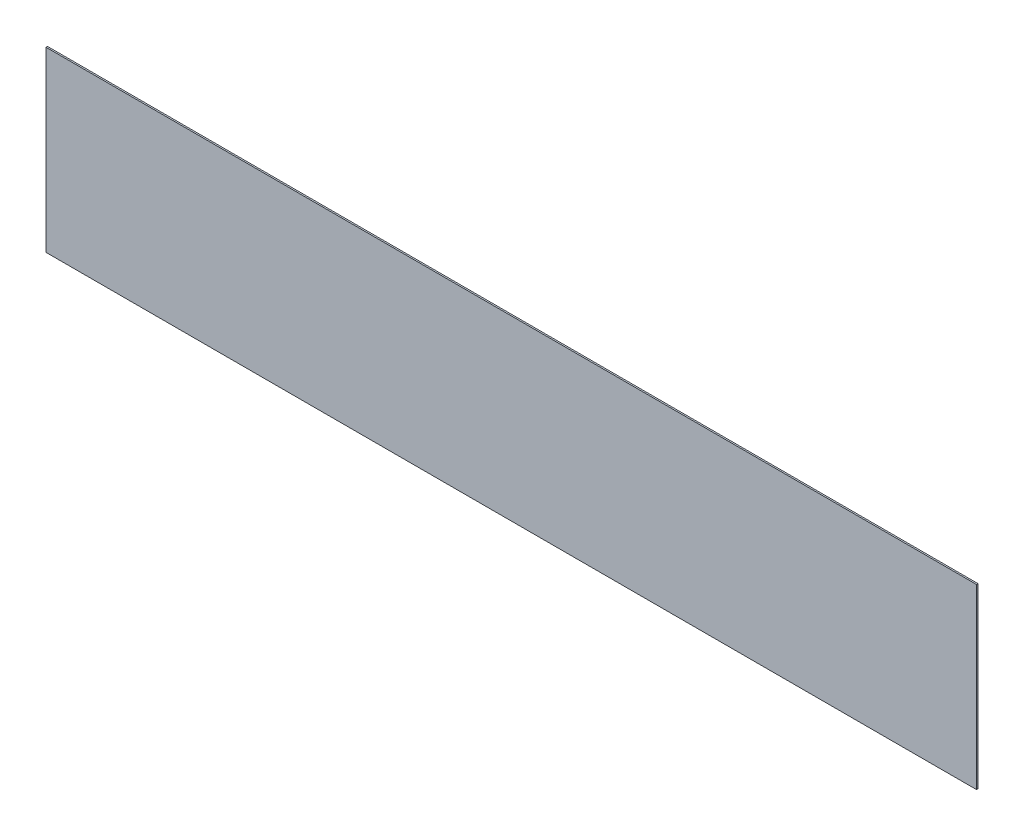
ISO-10303-21;
HEADER;
FILE_DESCRIPTION(('STEP AP214'),'2;1');
FILE_NAME('part.step','',(''),(''),'','','');
FILE_SCHEMA(('AUTOMOTIVE_DESIGN { 1 0 10303 214 1 1 1 1 }'));
ENDSEC;
DATA;
#1=APPLICATION_CONTEXT('core data for automotive mechanical design processes');
#2=APPLICATION_PROTOCOL_DEFINITION('international standard','automotive_design',2000,#1);
#3=PRODUCT_CONTEXT('',#1,'mechanical');
#4=PRODUCT('Part','Part','',(#3));
#5=PRODUCT_RELATED_PRODUCT_CATEGORY('part','',(#4));
#6=PRODUCT_DEFINITION_FORMATION('','',#4);
#7=PRODUCT_DEFINITION_CONTEXT('part definition',#1,'design');
#8=PRODUCT_DEFINITION('design','',#6,#7);
#9=PRODUCT_DEFINITION_SHAPE('','',#8);
#10=(LENGTH_UNIT() NAMED_UNIT(*) SI_UNIT(.MILLI.,.METRE.));
#11=(NAMED_UNIT(*) PLANE_ANGLE_UNIT() SI_UNIT($,.RADIAN.));
#12=(NAMED_UNIT(*) SI_UNIT($,.STERADIAN.) SOLID_ANGLE_UNIT());
#13=UNCERTAINTY_MEASURE_WITH_UNIT(LENGTH_MEASURE(1.E-05),#10,'distance_accuracy_value','');
#14=(GEOMETRIC_REPRESENTATION_CONTEXT(3) GLOBAL_UNCERTAINTY_ASSIGNED_CONTEXT((#13)) GLOBAL_UNIT_ASSIGNED_CONTEXT((#10,
#11,#12)) REPRESENTATION_CONTEXT('',''));
#15=CARTESIAN_POINT('',(0.,0.,0.));
#16=DIRECTION('',(0.,0.,1.));
#17=DIRECTION('',(1.,0.,0.));
#18=AXIS2_PLACEMENT_3D('',#15,#16,#17);
#19=CARTESIAN_POINT('',(0.,0.,1.));
#20=DIRECTION('',(1.,0.,0.));
#21=DIRECTION('',(0.,0.,-1.));
#22=AXIS2_PLACEMENT_3D('',#19,#20,#21);
#23=PLANE('',#22);
#24=DIRECTION('',(0.,-1.,0.));
#25=VECTOR('',#24,1.);
#26=CARTESIAN_POINT('',(0.,0.,0.));
#27=LINE('',#26,#25);
#28=CARTESIAN_POINT('',(0.,118.,0.));
#29=VERTEX_POINT('',#28);
#30=CARTESIAN_POINT('',(0.,0.,0.));
#31=VERTEX_POINT('',#30);
#32=EDGE_CURVE('E102',#29,#31,#27,.T.);
#33=ORIENTED_EDGE('',*,*,#32,.T.);
#34=DIRECTION('',(0.,0.,-1.));
#35=VECTOR('',#34,1.);
#36=CARTESIAN_POINT('',(0.,0.,1.));
#37=LINE('',#36,#35);
#38=CARTESIAN_POINT('',(0.,0.,1.));
#39=VERTEX_POINT('',#38);
#40=EDGE_CURVE('E11',#39,#31,#37,.T.);
#41=ORIENTED_EDGE('',*,*,#40,.F.);
#42=DIRECTION('',(0.,-1.,0.));
#43=VECTOR('',#42,1.);
#44=CARTESIAN_POINT('',(0.,0.,1.));
#45=LINE('',#44,#43);
#46=CARTESIAN_POINT('',(0.,118.,1.));
#47=VERTEX_POINT('',#46);
#48=EDGE_CURVE('E90',#47,#39,#45,.T.);
#49=ORIENTED_EDGE('',*,*,#48,.F.);
#50=DIRECTION('',(0.,0.,-1.));
#51=VECTOR('',#50,1.);
#52=CARTESIAN_POINT('',(0.,118.,1.));
#53=LINE('',#52,#51);
#54=EDGE_CURVE('E98',#47,#29,#53,.T.);
#55=ORIENTED_EDGE('',*,*,#54,.T.);
#56=EDGE_LOOP('',(#33,#41,#49,#55));
#57=FACE_BOUND('',#56,.T.);
#58=ADVANCED_FACE('F39',(#57),#23,.F.);
#59=CARTESIAN_POINT('',(0.,0.,1.));
#60=DIRECTION('',(0.,1.,0.));
#61=DIRECTION('',(0.,0.,1.));
#62=AXIS2_PLACEMENT_3D('',#59,#60,#61);
#63=PLANE('',#62);
#64=DIRECTION('',(1.,0.,0.));
#65=VECTOR('',#64,1.);
#66=CARTESIAN_POINT('',(0.,0.,0.));
#67=LINE('',#66,#65);
#68=CARTESIAN_POINT('',(618.,0.,0.));
#69=VERTEX_POINT('',#68);
#70=EDGE_CURVE('E94',#31,#69,#67,.T.);
#71=ORIENTED_EDGE('',*,*,#70,.T.);
#72=DIRECTION('',(0.,0.,-1.));
#73=VECTOR('',#72,1.);
#74=CARTESIAN_POINT('',(618.,0.,1.));
#75=LINE('',#74,#73);
#76=CARTESIAN_POINT('',(618.,0.,1.));
#77=VERTEX_POINT('',#76);
#78=EDGE_CURVE('E47',#77,#69,#75,.T.);
#79=ORIENTED_EDGE('',*,*,#78,.F.);
#80=DIRECTION('',(1.,0.,0.));
#81=VECTOR('',#80,1.);
#82=CARTESIAN_POINT('',(0.,0.,1.));
#83=LINE('',#82,#81);
#84=EDGE_CURVE('E85',#39,#77,#83,.T.);
#85=ORIENTED_EDGE('',*,*,#84,.F.);
#86=ORIENTED_EDGE('',*,*,#40,.T.);
#87=EDGE_LOOP('',(#71,#79,#85,#86));
#88=FACE_BOUND('',#87,.T.);
#89=ADVANCED_FACE('F93',(#88),#63,.F.);
#90=CARTESIAN_POINT('',(618.,0.,1.));
#91=DIRECTION('',(-1.,0.,0.));
#92=DIRECTION('',(0.,0.,1.));
#93=AXIS2_PLACEMENT_3D('',#90,#91,#92);
#94=PLANE('',#93);
#95=DIRECTION('',(0.,1.,0.));
#96=VECTOR('',#95,1.);
#97=CARTESIAN_POINT('',(618.,0.,0.));
#98=LINE('',#97,#96);
#99=CARTESIAN_POINT('',(618.,118.,0.));
#100=VERTEX_POINT('',#99);
#101=EDGE_CURVE('E72',#69,#100,#98,.T.);
#102=ORIENTED_EDGE('',*,*,#101,.T.);
#103=DIRECTION('',(0.,0.,-1.));
#104=VECTOR('',#103,1.);
#105=CARTESIAN_POINT('',(618.,118.,1.));
#106=LINE('',#105,#104);
#107=CARTESIAN_POINT('',(618.,118.,1.));
#108=VERTEX_POINT('',#107);
#109=EDGE_CURVE('E95',#108,#100,#106,.T.);
#110=ORIENTED_EDGE('',*,*,#109,.F.);
#111=DIRECTION('',(0.,1.,0.));
#112=VECTOR('',#111,1.);
#113=CARTESIAN_POINT('',(618.,0.,1.));
#114=LINE('',#113,#112);
#115=EDGE_CURVE('E88',#77,#108,#114,.T.);
#116=ORIENTED_EDGE('',*,*,#115,.F.);
#117=ORIENTED_EDGE('',*,*,#78,.T.);
#118=EDGE_LOOP('',(#102,#110,#116,#117));
#119=FACE_BOUND('',#118,.T.);
#120=ADVANCED_FACE('F96',(#119),#94,.F.);
#121=CARTESIAN_POINT('',(0.,118.,1.));
#122=DIRECTION('',(0.,-1.,0.));
#123=DIRECTION('',(0.,0.,-1.));
#124=AXIS2_PLACEMENT_3D('',#121,#122,#123);
#125=PLANE('',#124);
#126=DIRECTION('',(-1.,0.,0.));
#127=VECTOR('',#126,1.);
#128=CARTESIAN_POINT('',(0.,118.,0.));
#129=LINE('',#128,#127);
#130=EDGE_CURVE('E78',#100,#29,#129,.T.);
#131=ORIENTED_EDGE('',*,*,#130,.T.);
#132=ORIENTED_EDGE('',*,*,#54,.F.);
#133=DIRECTION('',(-1.,0.,0.));
#134=VECTOR('',#133,1.);
#135=CARTESIAN_POINT('',(0.,118.,1.));
#136=LINE('',#135,#134);
#137=EDGE_CURVE('E55',#108,#47,#136,.T.);
#138=ORIENTED_EDGE('',*,*,#137,.F.);
#139=ORIENTED_EDGE('',*,*,#109,.T.);
#140=EDGE_LOOP('',(#131,#132,#138,#139));
#141=FACE_BOUND('',#140,.T.);
#142=ADVANCED_FACE('F109',(#141),#125,.F.);
#143=CARTESIAN_POINT('',(0.,0.,1.));
#144=DIRECTION('',(0.,0.,-1.));
#145=DIRECTION('',(-1.,0.,0.));
#146=AXIS2_PLACEMENT_3D('',#143,#144,#145);
#147=PLANE('',#146);
#148=ORIENTED_EDGE('',*,*,#48,.T.);
#149=ORIENTED_EDGE('',*,*,#84,.T.);
#150=ORIENTED_EDGE('',*,*,#115,.T.);
#151=ORIENTED_EDGE('',*,*,#137,.T.);
#152=EDGE_LOOP('',(#148,#149,#150,#151));
#153=FACE_BOUND('',#152,.T.);
#154=ADVANCED_FACE('F86',(#153),#147,.F.);
#155=CARTESIAN_POINT('',(0.,0.,0.));
#156=DIRECTION('',(0.,0.,-1.));
#157=DIRECTION('',(-1.,0.,0.));
#158=AXIS2_PLACEMENT_3D('',#155,#156,#157);
#159=PLANE('',#158);
#160=ORIENTED_EDGE('',*,*,#32,.F.);
#161=ORIENTED_EDGE('',*,*,#130,.F.);
#162=ORIENTED_EDGE('',*,*,#101,.F.);
#163=ORIENTED_EDGE('',*,*,#70,.F.);
#164=EDGE_LOOP('',(#160,#161,#162,#163));
#165=FACE_BOUND('',#164,.T.);
#166=ADVANCED_FACE('F112',(#165),#159,.T.);
#167=CLOSED_SHELL('',(#58,#89,#120,#142,#154,#166));
#168=MANIFOLD_SOLID_BREP('B2',#167);
#169=ADVANCED_BREP_SHAPE_REPRESENTATION('',(#18,#168),#14);
#170=SHAPE_DEFINITION_REPRESENTATION(#9,#169);
ENDSEC;
END-ISO-10303-21;
